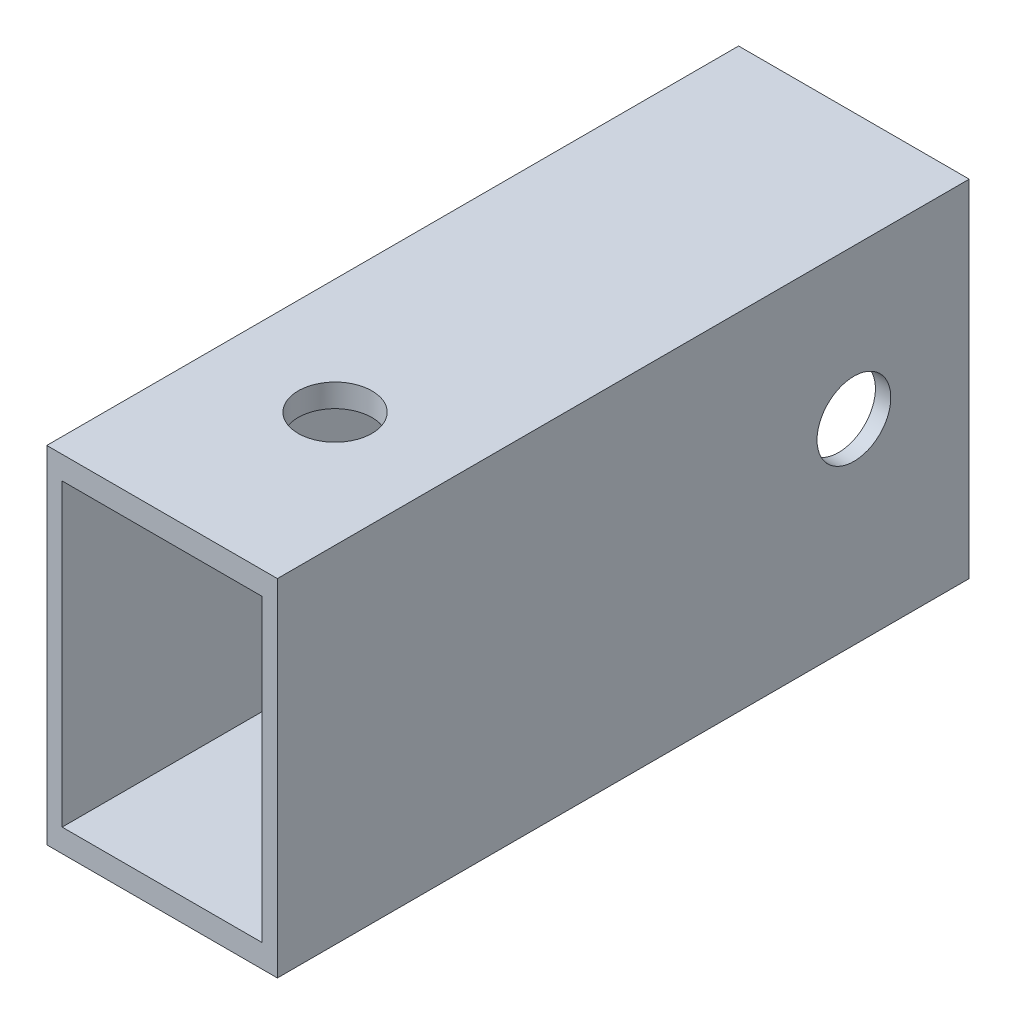
ISO-10303-21;
HEADER;
FILE_DESCRIPTION(('STEP AP214'),'2;1');
FILE_NAME('part.step','',(''),(''),'','','');
FILE_SCHEMA(('AUTOMOTIVE_DESIGN { 1 0 10303 214 1 1 1 1 }'));
ENDSEC;
DATA;
#1=APPLICATION_CONTEXT('core data for automotive mechanical design processes');
#2=APPLICATION_PROTOCOL_DEFINITION('international standard','automotive_design',2000,#1);
#3=PRODUCT_CONTEXT('',#1,'mechanical');
#4=PRODUCT('Part','Part','',(#3));
#5=PRODUCT_RELATED_PRODUCT_CATEGORY('part','',(#4));
#6=PRODUCT_DEFINITION_FORMATION('','',#4);
#7=PRODUCT_DEFINITION_CONTEXT('part definition',#1,'design');
#8=PRODUCT_DEFINITION('design','',#6,#7);
#9=PRODUCT_DEFINITION_SHAPE('','',#8);
#10=(LENGTH_UNIT() NAMED_UNIT(*) SI_UNIT(.MILLI.,.METRE.));
#11=(NAMED_UNIT(*) PLANE_ANGLE_UNIT() SI_UNIT($,.RADIAN.));
#12=(NAMED_UNIT(*) SI_UNIT($,.STERADIAN.) SOLID_ANGLE_UNIT());
#13=UNCERTAINTY_MEASURE_WITH_UNIT(LENGTH_MEASURE(1.E-05),#10,'distance_accuracy_value','');
#14=(GEOMETRIC_REPRESENTATION_CONTEXT(3) GLOBAL_UNCERTAINTY_ASSIGNED_CONTEXT((#13)) GLOBAL_UNIT_ASSIGNED_CONTEXT((#10,
#11,#12)) REPRESENTATION_CONTEXT('',''));
#15=CARTESIAN_POINT('',(0.,0.,0.));
#16=DIRECTION('',(0.,0.,1.));
#17=DIRECTION('',(1.,0.,0.));
#18=AXIS2_PLACEMENT_3D('',#15,#16,#17);
#19=CARTESIAN_POINT('',(0.,0.,30.));
#20=DIRECTION('',(0.,0.,-1.));
#21=DIRECTION('',(-1.,0.,0.));
#22=AXIS2_PLACEMENT_3D('',#19,#20,#21);
#23=PLANE('',#22);
#24=DIRECTION('',(0.,1.,0.));
#25=VECTOR('',#24,1.);
#26=CARTESIAN_POINT('',(5.,-7.5,30.));
#27=LINE('',#26,#25);
#28=CARTESIAN_POINT('',(5.,-7.5,30.));
#29=VERTEX_POINT('',#28);
#30=CARTESIAN_POINT('',(5.,7.5,30.));
#31=VERTEX_POINT('',#30);
#32=EDGE_CURVE('E137',#29,#31,#27,.T.);
#33=ORIENTED_EDGE('',*,*,#32,.T.);
#34=DIRECTION('',(-1.,0.,0.));
#35=VECTOR('',#34,1.);
#36=CARTESIAN_POINT('',(-5.,7.5,30.));
#37=LINE('',#36,#35);
#38=CARTESIAN_POINT('',(-5.,7.5,30.));
#39=VERTEX_POINT('',#38);
#40=EDGE_CURVE('E140',#31,#39,#37,.T.);
#41=ORIENTED_EDGE('',*,*,#40,.T.);
#42=DIRECTION('',(0.,-1.,0.));
#43=VECTOR('',#42,1.);
#44=CARTESIAN_POINT('',(-5.,-7.5,30.));
#45=LINE('',#44,#43);
#46=CARTESIAN_POINT('',(-5.,-7.5,30.));
#47=VERTEX_POINT('',#46);
#48=EDGE_CURVE('E143',#39,#47,#45,.T.);
#49=ORIENTED_EDGE('',*,*,#48,.T.);
#50=DIRECTION('',(1.,0.,0.));
#51=VECTOR('',#50,1.);
#52=CARTESIAN_POINT('',(-5.,-7.5,30.));
#53=LINE('',#52,#51);
#54=EDGE_CURVE('E145',#47,#29,#53,.T.);
#55=ORIENTED_EDGE('',*,*,#54,.T.);
#56=EDGE_LOOP('',(#33,#41,#49,#55));
#57=FACE_BOUND('',#56,.T.);
#58=DIRECTION('',(0.,1.,0.));
#59=VECTOR('',#58,1.);
#60=CARTESIAN_POINT('',(4.33333333333334,-6.5,30.));
#61=LINE('',#60,#59);
#62=CARTESIAN_POINT('',(4.33333333333334,-6.5,30.));
#63=VERTEX_POINT('',#62);
#64=CARTESIAN_POINT('',(4.33333333333334,6.5,30.));
#65=VERTEX_POINT('',#64);
#66=EDGE_CURVE('E99',#63,#65,#61,.T.);
#67=ORIENTED_EDGE('',*,*,#66,.F.);
#68=DIRECTION('',(1.,0.,0.));
#69=VECTOR('',#68,1.);
#70=CARTESIAN_POINT('',(-4.33333333333333,-6.5,30.));
#71=LINE('',#70,#69);
#72=CARTESIAN_POINT('',(-4.33333333333333,-6.5,30.));
#73=VERTEX_POINT('',#72);
#74=EDGE_CURVE('E121',#73,#63,#71,.T.);
#75=ORIENTED_EDGE('',*,*,#74,.F.);
#76=DIRECTION('',(0.,-1.,0.));
#77=VECTOR('',#76,1.);
#78=CARTESIAN_POINT('',(-4.33333333333333,-6.5,30.));
#79=LINE('',#78,#77);
#80=CARTESIAN_POINT('',(-4.33333333333333,6.5,30.));
#81=VERTEX_POINT('',#80);
#82=EDGE_CURVE('E119',#81,#73,#79,.T.);
#83=ORIENTED_EDGE('',*,*,#82,.F.);
#84=DIRECTION('',(-1.,0.,0.));
#85=VECTOR('',#84,1.);
#86=CARTESIAN_POINT('',(-4.33333333333333,6.5,30.));
#87=LINE('',#86,#85);
#88=EDGE_CURVE('E107',#65,#81,#87,.T.);
#89=ORIENTED_EDGE('',*,*,#88,.F.);
#90=EDGE_LOOP('',(#67,#75,#83,#89));
#91=FACE_BOUND('',#90,.T.);
#92=ADVANCED_FACE('F32',(#57,#91),#23,.F.);
#93=CARTESIAN_POINT('',(0.,0.,0.));
#94=DIRECTION('',(0.,0.,-1.));
#95=DIRECTION('',(-1.,0.,0.));
#96=AXIS2_PLACEMENT_3D('',#93,#94,#95);
#97=PLANE('',#96);
#98=DIRECTION('',(0.,1.,0.));
#99=VECTOR('',#98,1.);
#100=CARTESIAN_POINT('',(5.,-7.5,0.));
#101=LINE('',#100,#99);
#102=CARTESIAN_POINT('',(5.,-7.5,0.));
#103=VERTEX_POINT('',#102);
#104=CARTESIAN_POINT('',(5.,7.5,0.));
#105=VERTEX_POINT('',#104);
#106=EDGE_CURVE('E115',#103,#105,#101,.T.);
#107=ORIENTED_EDGE('',*,*,#106,.F.);
#108=DIRECTION('',(1.,0.,0.));
#109=VECTOR('',#108,1.);
#110=CARTESIAN_POINT('',(-5.,-7.5,0.));
#111=LINE('',#110,#109);
#112=CARTESIAN_POINT('',(-5.,-7.5,0.));
#113=VERTEX_POINT('',#112);
#114=EDGE_CURVE('E141',#113,#103,#111,.T.);
#115=ORIENTED_EDGE('',*,*,#114,.F.);
#116=DIRECTION('',(0.,-1.,0.));
#117=VECTOR('',#116,1.);
#118=CARTESIAN_POINT('',(-5.,-7.5,0.));
#119=LINE('',#118,#117);
#120=CARTESIAN_POINT('',(-5.,7.5,0.));
#121=VERTEX_POINT('',#120);
#122=EDGE_CURVE('E152',#121,#113,#119,.T.);
#123=ORIENTED_EDGE('',*,*,#122,.F.);
#124=DIRECTION('',(-1.,0.,0.));
#125=VECTOR('',#124,1.);
#126=CARTESIAN_POINT('',(-5.,7.5,0.));
#127=LINE('',#126,#125);
#128=EDGE_CURVE('E150',#105,#121,#127,.T.);
#129=ORIENTED_EDGE('',*,*,#128,.F.);
#130=EDGE_LOOP('',(#107,#115,#123,#129));
#131=FACE_BOUND('',#130,.T.);
#132=DIRECTION('',(1.,0.,0.));
#133=VECTOR('',#132,1.);
#134=CARTESIAN_POINT('',(-4.33333333333333,-6.5,0.));
#135=LINE('',#134,#133);
#136=CARTESIAN_POINT('',(-4.33333333333333,-6.5,0.));
#137=VERTEX_POINT('',#136);
#138=CARTESIAN_POINT('',(4.33333333333334,-6.5,0.));
#139=VERTEX_POINT('',#138);
#140=EDGE_CURVE('E108',#137,#139,#135,.T.);
#141=ORIENTED_EDGE('',*,*,#140,.T.);
#142=DIRECTION('',(0.,1.,0.));
#143=VECTOR('',#142,1.);
#144=CARTESIAN_POINT('',(4.33333333333334,-6.5,0.));
#145=LINE('',#144,#143);
#146=CARTESIAN_POINT('',(4.33333333333334,6.5,0.));
#147=VERTEX_POINT('',#146);
#148=EDGE_CURVE('E57',#139,#147,#145,.T.);
#149=ORIENTED_EDGE('',*,*,#148,.T.);
#150=DIRECTION('',(-1.,0.,0.));
#151=VECTOR('',#150,1.);
#152=CARTESIAN_POINT('',(-4.33333333333333,6.5,0.));
#153=LINE('',#152,#151);
#154=CARTESIAN_POINT('',(-4.33333333333333,6.5,0.));
#155=VERTEX_POINT('',#154);
#156=EDGE_CURVE('E114',#147,#155,#153,.T.);
#157=ORIENTED_EDGE('',*,*,#156,.T.);
#158=DIRECTION('',(0.,-1.,0.));
#159=VECTOR('',#158,1.);
#160=CARTESIAN_POINT('',(-4.33333333333333,-6.5,0.));
#161=LINE('',#160,#159);
#162=EDGE_CURVE('E129',#155,#137,#161,.T.);
#163=ORIENTED_EDGE('',*,*,#162,.T.);
#164=EDGE_LOOP('',(#141,#149,#157,#163));
#165=FACE_BOUND('',#164,.T.);
#166=ADVANCED_FACE('F198',(#131,#165),#97,.T.);
#167=CARTESIAN_POINT('',(5.,-7.5,30.));
#168=DIRECTION('',(-1.,0.,0.));
#169=DIRECTION('',(0.,0.,1.));
#170=AXIS2_PLACEMENT_3D('',#167,#168,#169);
#171=PLANE('',#170);
#172=CARTESIAN_POINT('',(5.,1.,5.));
#173=DIRECTION('',(-1.,0.,0.));
#174=DIRECTION('',(0.,0.,1.));
#175=AXIS2_PLACEMENT_3D('',#172,#173,#174);
#176=CIRCLE('',#175,1.6);
#177=CARTESIAN_POINT('',(5.,1.,6.6));
#178=VERTEX_POINT('',#177);
#179=EDGE_CURVE('E181',#178,#178,#176,.T.);
#180=ORIENTED_EDGE('',*,*,#179,.T.);
#181=EDGE_LOOP('',(#180));
#182=FACE_BOUND('',#181,.T.);
#183=ORIENTED_EDGE('',*,*,#106,.T.);
#184=DIRECTION('',(0.,0.,-1.));
#185=VECTOR('',#184,1.);
#186=CARTESIAN_POINT('',(5.,7.5,30.));
#187=LINE('',#186,#185);
#188=EDGE_CURVE('E11',#31,#105,#187,.T.);
#189=ORIENTED_EDGE('',*,*,#188,.F.);
#190=ORIENTED_EDGE('',*,*,#32,.F.);
#191=DIRECTION('',(0.,0.,-1.));
#192=VECTOR('',#191,1.);
#193=CARTESIAN_POINT('',(5.,-7.5,30.));
#194=LINE('',#193,#192);
#195=EDGE_CURVE('E147',#29,#103,#194,.T.);
#196=ORIENTED_EDGE('',*,*,#195,.T.);
#197=EDGE_LOOP('',(#183,#189,#190,#196));
#198=FACE_BOUND('',#197,.T.);
#199=ADVANCED_FACE('F34',(#182,#198),#171,.F.);
#200=CARTESIAN_POINT('',(-5.,7.5,30.));
#201=DIRECTION('',(0.,-1.,0.));
#202=DIRECTION('',(0.,0.,-1.));
#203=AXIS2_PLACEMENT_3D('',#200,#201,#202);
#204=PLANE('',#203);
#205=CARTESIAN_POINT('',(0.,7.5,22.5));
#206=DIRECTION('',(0.,1.,0.));
#207=DIRECTION('',(0.,0.,1.));
#208=AXIS2_PLACEMENT_3D('',#205,#206,#207);
#209=CIRCLE('',#208,1.6);
#210=CARTESIAN_POINT('',(0.,7.5,24.1));
#211=VERTEX_POINT('',#210);
#212=EDGE_CURVE('E168',#211,#211,#209,.T.);
#213=ORIENTED_EDGE('',*,*,#212,.F.);
#214=EDGE_LOOP('',(#213));
#215=FACE_BOUND('',#214,.T.);
#216=ORIENTED_EDGE('',*,*,#128,.T.);
#217=DIRECTION('',(0.,0.,-1.));
#218=VECTOR('',#217,1.);
#219=CARTESIAN_POINT('',(-5.,7.5,30.));
#220=LINE('',#219,#218);
#221=EDGE_CURVE('E41',#39,#121,#220,.T.);
#222=ORIENTED_EDGE('',*,*,#221,.F.);
#223=ORIENTED_EDGE('',*,*,#40,.F.);
#224=ORIENTED_EDGE('',*,*,#188,.T.);
#225=EDGE_LOOP('',(#216,#222,#223,#224));
#226=FACE_BOUND('',#225,.T.);
#227=ADVANCED_FACE('F224',(#215,#226),#204,.F.);
#228=CARTESIAN_POINT('',(-5.,-7.5,30.));
#229=DIRECTION('',(1.,0.,0.));
#230=DIRECTION('',(0.,0.,-1.));
#231=AXIS2_PLACEMENT_3D('',#228,#229,#230);
#232=PLANE('',#231);
#233=CARTESIAN_POINT('',(-5.,1.,5.));
#234=DIRECTION('',(-1.,0.,0.));
#235=DIRECTION('',(0.,0.,1.));
#236=AXIS2_PLACEMENT_3D('',#233,#234,#235);
#237=CIRCLE('',#236,1.6);
#238=CARTESIAN_POINT('',(-5.,1.,6.6));
#239=VERTEX_POINT('',#238);
#240=EDGE_CURVE('E178',#239,#239,#237,.T.);
#241=ORIENTED_EDGE('',*,*,#240,.F.);
#242=EDGE_LOOP('',(#241));
#243=FACE_BOUND('',#242,.T.);
#244=ORIENTED_EDGE('',*,*,#122,.T.);
#245=DIRECTION('',(0.,0.,-1.));
#246=VECTOR('',#245,1.);
#247=CARTESIAN_POINT('',(-5.,-7.5,30.));
#248=LINE('',#247,#246);
#249=EDGE_CURVE('E157',#47,#113,#248,.T.);
#250=ORIENTED_EDGE('',*,*,#249,.F.);
#251=ORIENTED_EDGE('',*,*,#48,.F.);
#252=ORIENTED_EDGE('',*,*,#221,.T.);
#253=EDGE_LOOP('',(#244,#250,#251,#252));
#254=FACE_BOUND('',#253,.T.);
#255=ADVANCED_FACE('F222',(#243,#254),#232,.F.);
#256=CARTESIAN_POINT('',(-5.,-7.5,30.));
#257=DIRECTION('',(0.,1.,0.));
#258=DIRECTION('',(0.,0.,1.));
#259=AXIS2_PLACEMENT_3D('',#256,#257,#258);
#260=PLANE('',#259);
#261=CARTESIAN_POINT('',(0.,-7.5,22.5));
#262=DIRECTION('',(0.,1.,0.));
#263=DIRECTION('',(0.,0.,1.));
#264=AXIS2_PLACEMENT_3D('',#261,#262,#263);
#265=CIRCLE('',#264,1.6);
#266=CARTESIAN_POINT('',(0.,-7.5,24.1));
#267=VERTEX_POINT('',#266);
#268=EDGE_CURVE('E163',#267,#267,#265,.T.);
#269=ORIENTED_EDGE('',*,*,#268,.T.);
#270=EDGE_LOOP('',(#269));
#271=FACE_BOUND('',#270,.T.);
#272=ORIENTED_EDGE('',*,*,#114,.T.);
#273=ORIENTED_EDGE('',*,*,#195,.F.);
#274=ORIENTED_EDGE('',*,*,#54,.F.);
#275=ORIENTED_EDGE('',*,*,#249,.T.);
#276=EDGE_LOOP('',(#272,#273,#274,#275));
#277=FACE_BOUND('',#276,.T.);
#278=ADVANCED_FACE('F219',(#271,#277),#260,.F.);
#279=CARTESIAN_POINT('',(4.33333333333334,-6.5,30.));
#280=DIRECTION('',(-1.,0.,0.));
#281=DIRECTION('',(0.,0.,1.));
#282=AXIS2_PLACEMENT_3D('',#279,#280,#281);
#283=PLANE('',#282);
#284=CARTESIAN_POINT('',(4.33333333333334,1.,5.));
#285=DIRECTION('',(-1.,0.,0.));
#286=DIRECTION('',(0.,0.,1.));
#287=AXIS2_PLACEMENT_3D('',#284,#285,#286);
#288=CIRCLE('',#287,1.6);
#289=CARTESIAN_POINT('',(4.33333333333334,1.,6.6));
#290=VERTEX_POINT('',#289);
#291=EDGE_CURVE('E173',#290,#290,#288,.T.);
#292=ORIENTED_EDGE('',*,*,#291,.F.);
#293=EDGE_LOOP('',(#292));
#294=FACE_BOUND('',#293,.T.);
#295=ORIENTED_EDGE('',*,*,#148,.F.);
#296=DIRECTION('',(0.,0.,-1.));
#297=VECTOR('',#296,1.);
#298=CARTESIAN_POINT('',(4.33333333333334,-6.5,30.));
#299=LINE('',#298,#297);
#300=EDGE_CURVE('E103',#63,#139,#299,.T.);
#301=ORIENTED_EDGE('',*,*,#300,.F.);
#302=ORIENTED_EDGE('',*,*,#66,.T.);
#303=DIRECTION('',(0.,0.,-1.));
#304=VECTOR('',#303,1.);
#305=CARTESIAN_POINT('',(4.33333333333334,6.5,30.));
#306=LINE('',#305,#304);
#307=EDGE_CURVE('E102',#65,#147,#306,.T.);
#308=ORIENTED_EDGE('',*,*,#307,.T.);
#309=EDGE_LOOP('',(#295,#301,#302,#308));
#310=FACE_BOUND('',#309,.T.);
#311=ADVANCED_FACE('F101',(#294,#310),#283,.T.);
#312=CARTESIAN_POINT('',(-4.33333333333333,6.5,30.));
#313=DIRECTION('',(0.,-1.,0.));
#314=DIRECTION('',(0.,0.,-1.));
#315=AXIS2_PLACEMENT_3D('',#312,#313,#314);
#316=PLANE('',#315);
#317=CARTESIAN_POINT('',(0.,6.5,22.5));
#318=DIRECTION('',(0.,-1.,0.));
#319=DIRECTION('',(0.,0.,-1.));
#320=AXIS2_PLACEMENT_3D('',#317,#318,#319);
#321=CIRCLE('',#320,1.6);
#322=CARTESIAN_POINT('',(0.,6.5,20.9));
#323=VERTEX_POINT('',#322);
#324=EDGE_CURVE('E127',#323,#323,#321,.T.);
#325=ORIENTED_EDGE('',*,*,#324,.F.);
#326=EDGE_LOOP('',(#325));
#327=FACE_BOUND('',#326,.T.);
#328=ORIENTED_EDGE('',*,*,#156,.F.);
#329=ORIENTED_EDGE('',*,*,#307,.F.);
#330=ORIENTED_EDGE('',*,*,#88,.T.);
#331=DIRECTION('',(0.,0.,-1.));
#332=VECTOR('',#331,1.);
#333=CARTESIAN_POINT('',(-4.33333333333333,6.5,30.));
#334=LINE('',#333,#332);
#335=EDGE_CURVE('E116',#81,#155,#334,.T.);
#336=ORIENTED_EDGE('',*,*,#335,.T.);
#337=EDGE_LOOP('',(#328,#329,#330,#336));
#338=FACE_BOUND('',#337,.T.);
#339=ADVANCED_FACE('F111',(#327,#338),#316,.T.);
#340=CARTESIAN_POINT('',(-4.33333333333333,-6.5,30.));
#341=DIRECTION('',(1.,0.,0.));
#342=DIRECTION('',(0.,0.,-1.));
#343=AXIS2_PLACEMENT_3D('',#340,#341,#342);
#344=PLANE('',#343);
#345=CARTESIAN_POINT('',(-4.33333333333334,1.,5.));
#346=DIRECTION('',(1.,0.,0.));
#347=DIRECTION('',(0.,0.,-1.));
#348=AXIS2_PLACEMENT_3D('',#345,#346,#347);
#349=CIRCLE('',#348,1.6);
#350=CARTESIAN_POINT('',(-4.33333333333334,1.,3.4));
#351=VERTEX_POINT('',#350);
#352=EDGE_CURVE('E36',#351,#351,#349,.T.);
#353=ORIENTED_EDGE('',*,*,#352,.F.);
#354=EDGE_LOOP('',(#353));
#355=FACE_BOUND('',#354,.T.);
#356=ORIENTED_EDGE('',*,*,#162,.F.);
#357=ORIENTED_EDGE('',*,*,#335,.F.);
#358=ORIENTED_EDGE('',*,*,#82,.T.);
#359=DIRECTION('',(0.,0.,-1.));
#360=VECTOR('',#359,1.);
#361=CARTESIAN_POINT('',(-4.33333333333333,-6.5,30.));
#362=LINE('',#361,#360);
#363=EDGE_CURVE('E49',#73,#137,#362,.T.);
#364=ORIENTED_EDGE('',*,*,#363,.T.);
#365=EDGE_LOOP('',(#356,#357,#358,#364));
#366=FACE_BOUND('',#365,.T.);
#367=ADVANCED_FACE('F191',(#355,#366),#344,.T.);
#368=CARTESIAN_POINT('',(-4.33333333333333,-6.5,30.));
#369=DIRECTION('',(0.,1.,0.));
#370=DIRECTION('',(0.,0.,1.));
#371=AXIS2_PLACEMENT_3D('',#368,#369,#370);
#372=PLANE('',#371);
#373=CARTESIAN_POINT('',(0.,-6.5,22.5));
#374=DIRECTION('',(0.,1.,0.));
#375=DIRECTION('',(0.,0.,1.));
#376=AXIS2_PLACEMENT_3D('',#373,#374,#375);
#377=CIRCLE('',#376,1.6);
#378=CARTESIAN_POINT('',(0.,-6.5,24.1));
#379=VERTEX_POINT('',#378);
#380=EDGE_CURVE('E161',#379,#379,#377,.T.);
#381=ORIENTED_EDGE('',*,*,#380,.F.);
#382=EDGE_LOOP('',(#381));
#383=FACE_BOUND('',#382,.T.);
#384=ORIENTED_EDGE('',*,*,#140,.F.);
#385=ORIENTED_EDGE('',*,*,#363,.F.);
#386=ORIENTED_EDGE('',*,*,#74,.T.);
#387=ORIENTED_EDGE('',*,*,#300,.T.);
#388=EDGE_LOOP('',(#384,#385,#386,#387));
#389=FACE_BOUND('',#388,.T.);
#390=ADVANCED_FACE('F194',(#383,#389),#372,.T.);
#391=CARTESIAN_POINT('',(0.,-7.5,22.5));
#392=DIRECTION('',(0.,1.,0.));
#393=DIRECTION('',(0.,0.,1.));
#394=AXIS2_PLACEMENT_3D('',#391,#392,#393);
#395=CYLINDRICAL_SURFACE('',#394,1.6);
#396=ORIENTED_EDGE('',*,*,#380,.T.);
#397=EDGE_LOOP('',(#396));
#398=FACE_BOUND('',#397,.T.);
#399=ORIENTED_EDGE('',*,*,#268,.F.);
#400=EDGE_LOOP('',(#399));
#401=FACE_BOUND('',#400,.T.);
#402=ADVANCED_FACE('F200',(#398,#401),#395,.F.);
#403=ORIENTED_EDGE('',*,*,#324,.T.);
#404=EDGE_LOOP('',(#403));
#405=FACE_BOUND('',#404,.T.);
#406=ORIENTED_EDGE('',*,*,#212,.T.);
#407=EDGE_LOOP('',(#406));
#408=FACE_BOUND('',#407,.T.);
#409=ADVANCED_FACE('F206',(#405,#408),#395,.F.);
#410=CARTESIAN_POINT('',(5.,1.,5.));
#411=DIRECTION('',(-1.,0.,0.));
#412=DIRECTION('',(0.,0.,1.));
#413=AXIS2_PLACEMENT_3D('',#410,#411,#412);
#414=CYLINDRICAL_SURFACE('',#413,1.6);
#415=ORIENTED_EDGE('',*,*,#352,.T.);
#416=EDGE_LOOP('',(#415));
#417=FACE_BOUND('',#416,.T.);
#418=ORIENTED_EDGE('',*,*,#240,.T.);
#419=EDGE_LOOP('',(#418));
#420=FACE_BOUND('',#419,.T.);
#421=ADVANCED_FACE('F188',(#417,#420),#414,.F.);
#422=ORIENTED_EDGE('',*,*,#291,.T.);
#423=EDGE_LOOP('',(#422));
#424=FACE_BOUND('',#423,.T.);
#425=ORIENTED_EDGE('',*,*,#179,.F.);
#426=EDGE_LOOP('',(#425));
#427=FACE_BOUND('',#426,.T.);
#428=ADVANCED_FACE('F252',(#424,#427),#414,.F.);
#429=CLOSED_SHELL('',(#92,#166,#199,#227,#255,#278,#311,#339,#367,#390,#402,#409,#421,#428));
#430=MANIFOLD_SOLID_BREP('B2',#429);
#431=ADVANCED_BREP_SHAPE_REPRESENTATION('',(#18,#430),#14);
#432=SHAPE_DEFINITION_REPRESENTATION(#9,#431);
ENDSEC;
END-ISO-10303-21;
